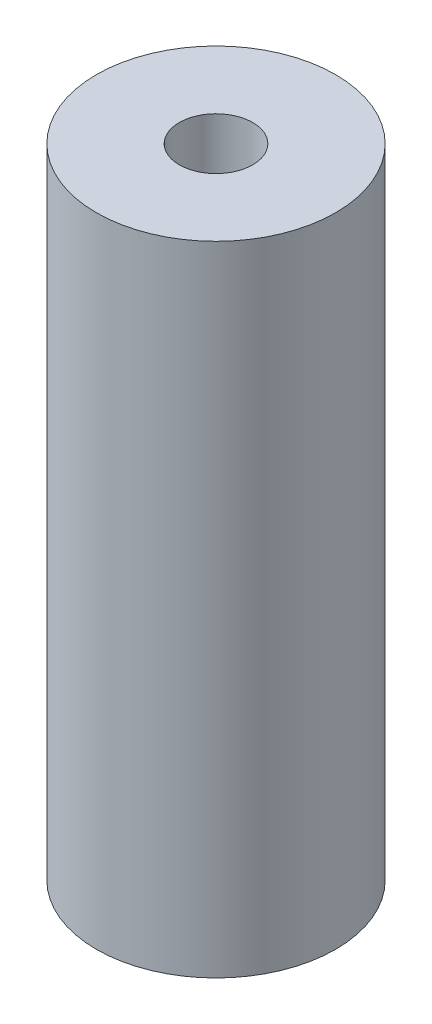
ISO-10303-21;
HEADER;
FILE_DESCRIPTION(('STEP AP214'),'2;1');
FILE_NAME('part.step','',(''),(''),'','','');
FILE_SCHEMA(('AUTOMOTIVE_DESIGN { 1 0 10303 214 1 1 1 1 }'));
ENDSEC;
DATA;
#1=APPLICATION_CONTEXT('core data for automotive mechanical design processes');
#2=APPLICATION_PROTOCOL_DEFINITION('international standard','automotive_design',2000,#1);
#3=PRODUCT_CONTEXT('',#1,'mechanical');
#4=PRODUCT('Part','Part','',(#3));
#5=PRODUCT_RELATED_PRODUCT_CATEGORY('part','',(#4));
#6=PRODUCT_DEFINITION_FORMATION('','',#4);
#7=PRODUCT_DEFINITION_CONTEXT('part definition',#1,'design');
#8=PRODUCT_DEFINITION('design','',#6,#7);
#9=PRODUCT_DEFINITION_SHAPE('','',#8);
#10=(LENGTH_UNIT() NAMED_UNIT(*) SI_UNIT(.MILLI.,.METRE.));
#11=(NAMED_UNIT(*) PLANE_ANGLE_UNIT() SI_UNIT($,.RADIAN.));
#12=(NAMED_UNIT(*) SI_UNIT($,.STERADIAN.) SOLID_ANGLE_UNIT());
#13=UNCERTAINTY_MEASURE_WITH_UNIT(LENGTH_MEASURE(1.E-05),#10,'distance_accuracy_value','');
#14=(GEOMETRIC_REPRESENTATION_CONTEXT(3) GLOBAL_UNCERTAINTY_ASSIGNED_CONTEXT((#13)) GLOBAL_UNIT_ASSIGNED_CONTEXT((#10,
#11,#12)) REPRESENTATION_CONTEXT('',''));
#15=CARTESIAN_POINT('',(0.,0.,0.));
#16=DIRECTION('',(0.,0.,1.));
#17=DIRECTION('',(1.,0.,0.));
#18=AXIS2_PLACEMENT_3D('',#15,#16,#17);
#19=CARTESIAN_POINT('',(0.,25.4,0.));
#20=DIRECTION('',(0.,1.,0.));
#21=DIRECTION('',(0.,0.,1.));
#22=AXIS2_PLACEMENT_3D('',#19,#20,#21);
#23=PLANE('',#22);
#24=CARTESIAN_POINT('',(0.,25.4,0.));
#25=DIRECTION('',(0.,1.,0.));
#26=DIRECTION('',(0.,0.,1.));
#27=AXIS2_PLACEMENT_3D('',#24,#25,#26);
#28=CIRCLE('',#27,4.7625);
#29=CARTESIAN_POINT('',(0.,25.4,4.7625));
#30=VERTEX_POINT('',#29);
#31=EDGE_CURVE('E10',#30,#30,#28,.T.);
#32=ORIENTED_EDGE('',*,*,#31,.T.);
#33=EDGE_LOOP('',(#32));
#34=FACE_BOUND('',#33,.T.);
#35=CARTESIAN_POINT('',(0.,25.4,0.));
#36=DIRECTION('',(0.,1.,0.));
#37=DIRECTION('',(0.,0.,1.));
#38=AXIS2_PLACEMENT_3D('',#35,#36,#37);
#39=CIRCLE('',#38,1.4605);
#40=CARTESIAN_POINT('',(0.,25.4,1.4605));
#41=VERTEX_POINT('',#40);
#42=EDGE_CURVE('E41',#41,#41,#39,.T.);
#43=ORIENTED_EDGE('',*,*,#42,.F.);
#44=EDGE_LOOP('',(#43));
#45=FACE_BOUND('',#44,.T.);
#46=ADVANCED_FACE('F30',(#34,#45),#23,.T.);
#47=CARTESIAN_POINT('',(0.,0.,0.));
#48=DIRECTION('',(0.,1.,0.));
#49=DIRECTION('',(0.,0.,1.));
#50=AXIS2_PLACEMENT_3D('',#47,#48,#49);
#51=PLANE('',#50);
#52=CARTESIAN_POINT('',(0.,0.,0.));
#53=DIRECTION('',(0.,1.,0.));
#54=DIRECTION('',(0.,0.,1.));
#55=AXIS2_PLACEMENT_3D('',#52,#53,#54);
#56=CIRCLE('',#55,4.7625);
#57=CARTESIAN_POINT('',(0.,0.,4.7625));
#58=VERTEX_POINT('',#57);
#59=EDGE_CURVE('E34',#58,#58,#56,.T.);
#60=ORIENTED_EDGE('',*,*,#59,.F.);
#61=EDGE_LOOP('',(#60));
#62=FACE_BOUND('',#61,.T.);
#63=CARTESIAN_POINT('',(0.,0.,0.));
#64=DIRECTION('',(0.,1.,0.));
#65=DIRECTION('',(0.,0.,1.));
#66=AXIS2_PLACEMENT_3D('',#63,#64,#65);
#67=CIRCLE('',#66,1.4605);
#68=CARTESIAN_POINT('',(0.,0.,1.4605));
#69=VERTEX_POINT('',#68);
#70=EDGE_CURVE('E43',#69,#69,#67,.T.);
#71=ORIENTED_EDGE('',*,*,#70,.T.);
#72=EDGE_LOOP('',(#71));
#73=FACE_BOUND('',#72,.T.);
#74=ADVANCED_FACE('F53',(#62,#73),#51,.F.);
#75=CARTESIAN_POINT('',(0.,25.4,0.));
#76=DIRECTION('',(0.,-1.,0.));
#77=DIRECTION('',(0.,0.,-1.));
#78=AXIS2_PLACEMENT_3D('',#75,#76,#77);
#79=CYLINDRICAL_SURFACE('',#78,4.7625);
#80=ORIENTED_EDGE('',*,*,#31,.F.);
#81=EDGE_LOOP('',(#80));
#82=FACE_BOUND('',#81,.T.);
#83=ORIENTED_EDGE('',*,*,#59,.T.);
#84=EDGE_LOOP('',(#83));
#85=FACE_BOUND('',#84,.T.);
#86=ADVANCED_FACE('F32',(#82,#85),#79,.T.);
#87=CARTESIAN_POINT('',(0.,25.4,0.));
#88=DIRECTION('',(0.,-1.,0.));
#89=DIRECTION('',(0.,0.,-1.));
#90=AXIS2_PLACEMENT_3D('',#87,#88,#89);
#91=CYLINDRICAL_SURFACE('',#90,1.4605);
#92=ORIENTED_EDGE('',*,*,#42,.T.);
#93=EDGE_LOOP('',(#92));
#94=FACE_BOUND('',#93,.T.);
#95=ORIENTED_EDGE('',*,*,#70,.F.);
#96=EDGE_LOOP('',(#95));
#97=FACE_BOUND('',#96,.T.);
#98=ADVANCED_FACE('F49',(#94,#97),#91,.F.);
#99=CLOSED_SHELL('',(#46,#74,#86,#98));
#100=MANIFOLD_SOLID_BREP('B2',#99);
#101=ADVANCED_BREP_SHAPE_REPRESENTATION('',(#18,#100),#14);
#102=SHAPE_DEFINITION_REPRESENTATION(#9,#101);
ENDSEC;
END-ISO-10303-21;
